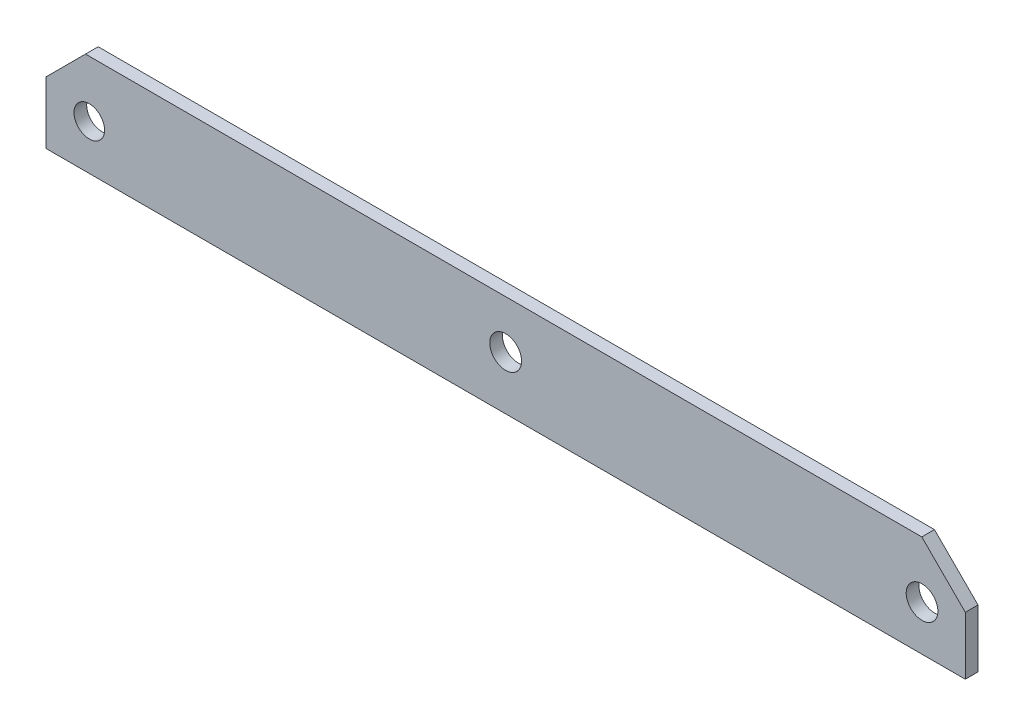
ISO-10303-21;
HEADER;
FILE_DESCRIPTION(('STEP AP214'),'2;1');
FILE_NAME('part.step','',(''),(''),'','','');
FILE_SCHEMA(('AUTOMOTIVE_DESIGN { 1 0 10303 214 1 1 1 1 }'));
ENDSEC;
DATA;
#1=APPLICATION_CONTEXT('core data for automotive mechanical design processes');
#2=APPLICATION_PROTOCOL_DEFINITION('international standard','automotive_design',2000,#1);
#3=PRODUCT_CONTEXT('',#1,'mechanical');
#4=PRODUCT('Part','Part','',(#3));
#5=PRODUCT_RELATED_PRODUCT_CATEGORY('part','',(#4));
#6=PRODUCT_DEFINITION_FORMATION('','',#4);
#7=PRODUCT_DEFINITION_CONTEXT('part definition',#1,'design');
#8=PRODUCT_DEFINITION('design','',#6,#7);
#9=PRODUCT_DEFINITION_SHAPE('','',#8);
#10=(LENGTH_UNIT() NAMED_UNIT(*) SI_UNIT(.MILLI.,.METRE.));
#11=(NAMED_UNIT(*) PLANE_ANGLE_UNIT() SI_UNIT($,.RADIAN.));
#12=(NAMED_UNIT(*) SI_UNIT($,.STERADIAN.) SOLID_ANGLE_UNIT());
#13=UNCERTAINTY_MEASURE_WITH_UNIT(LENGTH_MEASURE(1.E-05),#10,'distance_accuracy_value','');
#14=(GEOMETRIC_REPRESENTATION_CONTEXT(3) GLOBAL_UNCERTAINTY_ASSIGNED_CONTEXT((#13)) GLOBAL_UNIT_ASSIGNED_CONTEXT((#10,
#11,#12)) REPRESENTATION_CONTEXT('',''));
#15=CARTESIAN_POINT('',(0.,0.,0.));
#16=DIRECTION('',(0.,0.,1.));
#17=DIRECTION('',(1.,0.,0.));
#18=AXIS2_PLACEMENT_3D('',#15,#16,#17);
#19=CARTESIAN_POINT('',(122.254977285979,122.254977285981,3.175));
#20=DIRECTION('',(0.707106781186539,0.707106781186556,0.));
#21=DIRECTION('',(-0.707106781186556,0.707106781186539,0.));
#22=AXIS2_PLACEMENT_3D('',#19,#20,#21);
#23=PLANE('',#22);
#24=DIRECTION('',(0.707106781186556,-0.707106781186539,0.));
#25=VECTOR('',#24,1.);
#26=CARTESIAN_POINT('',(122.254977285979,122.254977285981,0.));
#27=LINE('',#26,#25);
#28=CARTESIAN_POINT('',(219.109954571962,25.4,0.));
#29=VERTEX_POINT('',#28);
#30=CARTESIAN_POINT('',(230.,14.5099545719626,0.));
#31=VERTEX_POINT('',#30);
#32=EDGE_CURVE('E128',#29,#31,#27,.T.);
#33=ORIENTED_EDGE('',*,*,#32,.F.);
#34=DIRECTION('',(0.,0.,-1.));
#35=VECTOR('',#34,1.);
#36=CARTESIAN_POINT('',(219.109954571962,25.4,3.175));
#37=LINE('',#36,#35);
#38=CARTESIAN_POINT('',(219.109954571962,25.4,3.175));
#39=VERTEX_POINT('',#38);
#40=EDGE_CURVE('E11',#39,#29,#37,.T.);
#41=ORIENTED_EDGE('',*,*,#40,.F.);
#42=DIRECTION('',(0.707106781186556,-0.707106781186539,0.));
#43=VECTOR('',#42,1.);
#44=CARTESIAN_POINT('',(122.254977285979,122.254977285981,3.175));
#45=LINE('',#44,#43);
#46=CARTESIAN_POINT('',(230.,14.5099545719626,3.175));
#47=VERTEX_POINT('',#46);
#48=EDGE_CURVE('E192',#39,#47,#45,.T.);
#49=ORIENTED_EDGE('',*,*,#48,.T.);
#50=DIRECTION('',(0.,0.,-1.));
#51=VECTOR('',#50,1.);
#52=CARTESIAN_POINT('',(230.,14.5099545719626,3.175));
#53=LINE('',#52,#51);
#54=EDGE_CURVE('E79',#47,#31,#53,.T.);
#55=ORIENTED_EDGE('',*,*,#54,.T.);
#56=EDGE_LOOP('',(#33,#41,#49,#55));
#57=FACE_BOUND('',#56,.T.);
#58=ADVANCED_FACE('F33',(#57),#23,.T.);
#59=CARTESIAN_POINT('',(0.,25.4,3.175));
#60=DIRECTION('',(0.,1.,0.));
#61=DIRECTION('',(0.,0.,1.));
#62=AXIS2_PLACEMENT_3D('',#59,#60,#61);
#63=PLANE('',#62);
#64=DIRECTION('',(1.,0.,0.));
#65=VECTOR('',#64,1.);
#66=CARTESIAN_POINT('',(0.,25.4,0.));
#67=LINE('',#66,#65);
#68=CARTESIAN_POINT('',(9.87852439365131,25.4,0.));
#69=VERTEX_POINT('',#68);
#70=EDGE_CURVE('E130',#69,#29,#67,.T.);
#71=ORIENTED_EDGE('',*,*,#70,.F.);
#72=DIRECTION('',(0.,0.,-1.));
#73=VECTOR('',#72,1.);
#74=CARTESIAN_POINT('',(9.87852439365131,25.4,3.175));
#75=LINE('',#74,#73);
#76=CARTESIAN_POINT('',(9.87852439365131,25.4,3.175));
#77=VERTEX_POINT('',#76);
#78=EDGE_CURVE('E42',#77,#69,#75,.T.);
#79=ORIENTED_EDGE('',*,*,#78,.F.);
#80=DIRECTION('',(1.,0.,0.));
#81=VECTOR('',#80,1.);
#82=CARTESIAN_POINT('',(0.,25.4,3.175));
#83=LINE('',#82,#81);
#84=EDGE_CURVE('E114',#77,#39,#83,.T.);
#85=ORIENTED_EDGE('',*,*,#84,.T.);
#86=ORIENTED_EDGE('',*,*,#40,.T.);
#87=EDGE_LOOP('',(#71,#79,#85,#86));
#88=FACE_BOUND('',#87,.T.);
#89=ADVANCED_FACE('F149',(#88),#63,.T.);
#90=CARTESIAN_POINT('',(-7.76073780317433,7.7607378031743,3.175));
#91=DIRECTION('',(-0.707106781186549,0.707106781186546,0.));
#92=DIRECTION('',(-0.707106781186546,-0.707106781186549,0.));
#93=AXIS2_PLACEMENT_3D('',#90,#91,#92);
#94=PLANE('',#93);
#95=DIRECTION('',(0.707106781186546,0.707106781186549,0.));
#96=VECTOR('',#95,1.);
#97=CARTESIAN_POINT('',(-7.76073780317433,7.7607378031743,0.));
#98=LINE('',#97,#96);
#99=CARTESIAN_POINT('',(0.,15.5214756063486,0.));
#100=VERTEX_POINT('',#99);
#101=EDGE_CURVE('E133',#100,#69,#98,.T.);
#102=ORIENTED_EDGE('',*,*,#101,.F.);
#103=DIRECTION('',(0.,0.,-1.));
#104=VECTOR('',#103,1.);
#105=CARTESIAN_POINT('',(0.,15.5214756063486,3.175));
#106=LINE('',#105,#104);
#107=CARTESIAN_POINT('',(0.,15.5214756063486,3.175));
#108=VERTEX_POINT('',#107);
#109=EDGE_CURVE('E101',#108,#100,#106,.T.);
#110=ORIENTED_EDGE('',*,*,#109,.F.);
#111=DIRECTION('',(0.707106781186546,0.707106781186549,0.));
#112=VECTOR('',#111,1.);
#113=CARTESIAN_POINT('',(-7.76073780317433,7.7607378031743,3.175));
#114=LINE('',#113,#112);
#115=EDGE_CURVE('E112',#108,#77,#114,.T.);
#116=ORIENTED_EDGE('',*,*,#115,.T.);
#117=ORIENTED_EDGE('',*,*,#78,.T.);
#118=EDGE_LOOP('',(#102,#110,#116,#117));
#119=FACE_BOUND('',#118,.T.);
#120=ADVANCED_FACE('F146',(#119),#94,.T.);
#121=CARTESIAN_POINT('',(0.,0.,3.175));
#122=DIRECTION('',(-1.,0.,0.));
#123=DIRECTION('',(0.,-1.,0.));
#124=AXIS2_PLACEMENT_3D('',#121,#122,#123);
#125=PLANE('',#124);
#126=DIRECTION('',(0.,1.,0.));
#127=VECTOR('',#126,1.);
#128=CARTESIAN_POINT('',(0.,0.,0.));
#129=LINE('',#128,#127);
#130=CARTESIAN_POINT('',(0.,0.,0.));
#131=VERTEX_POINT('',#130);
#132=EDGE_CURVE('E98',#131,#100,#129,.T.);
#133=ORIENTED_EDGE('',*,*,#132,.F.);
#134=DIRECTION('',(0.,0.,-1.));
#135=VECTOR('',#134,1.);
#136=CARTESIAN_POINT('',(0.,0.,3.175));
#137=LINE('',#136,#135);
#138=CARTESIAN_POINT('',(0.,0.,3.175));
#139=VERTEX_POINT('',#138);
#140=EDGE_CURVE('E92',#139,#131,#137,.T.);
#141=ORIENTED_EDGE('',*,*,#140,.F.);
#142=DIRECTION('',(0.,1.,0.));
#143=VECTOR('',#142,1.);
#144=CARTESIAN_POINT('',(0.,0.,3.175));
#145=LINE('',#144,#143);
#146=EDGE_CURVE('E96',#139,#108,#145,.T.);
#147=ORIENTED_EDGE('',*,*,#146,.T.);
#148=ORIENTED_EDGE('',*,*,#109,.T.);
#149=EDGE_LOOP('',(#133,#141,#147,#148));
#150=FACE_BOUND('',#149,.T.);
#151=ADVANCED_FACE('F94',(#150),#125,.T.);
#152=CARTESIAN_POINT('',(0.,0.,3.175));
#153=DIRECTION('',(0.,1.,0.));
#154=DIRECTION('',(0.,0.,1.));
#155=AXIS2_PLACEMENT_3D('',#152,#153,#154);
#156=PLANE('',#155);
#157=DIRECTION('',(1.,0.,0.));
#158=VECTOR('',#157,1.);
#159=CARTESIAN_POINT('',(0.,0.,0.));
#160=LINE('',#159,#158);
#161=CARTESIAN_POINT('',(230.,0.,0.));
#162=VERTEX_POINT('',#161);
#163=EDGE_CURVE('E137',#131,#162,#160,.T.);
#164=ORIENTED_EDGE('',*,*,#163,.T.);
#165=DIRECTION('',(0.,0.,-1.));
#166=VECTOR('',#165,1.);
#167=CARTESIAN_POINT('',(230.,0.,3.175));
#168=LINE('',#167,#166);
#169=CARTESIAN_POINT('',(230.,0.,3.175));
#170=VERTEX_POINT('',#169);
#171=EDGE_CURVE('E102',#170,#162,#168,.T.);
#172=ORIENTED_EDGE('',*,*,#171,.F.);
#173=DIRECTION('',(1.,0.,0.));
#174=VECTOR('',#173,1.);
#175=CARTESIAN_POINT('',(0.,0.,3.175));
#176=LINE('',#175,#174);
#177=EDGE_CURVE('E105',#139,#170,#176,.T.);
#178=ORIENTED_EDGE('',*,*,#177,.F.);
#179=ORIENTED_EDGE('',*,*,#140,.T.);
#180=EDGE_LOOP('',(#164,#172,#178,#179));
#181=FACE_BOUND('',#180,.T.);
#182=ADVANCED_FACE('F106',(#181),#156,.F.);
#183=CARTESIAN_POINT('',(10.827296289935,11.2956102799355,3.175));
#184=DIRECTION('',(0.,0.,-1.));
#185=DIRECTION('',(-1.,0.,0.));
#186=AXIS2_PLACEMENT_3D('',#183,#184,#185);
#187=CYLINDRICAL_SURFACE('',#186,3.82498757359968);
#188=CARTESIAN_POINT('',(10.827296289935,11.2956102799355,3.175));
#189=DIRECTION('',(0.,0.,1.));
#190=DIRECTION('',(1.,0.,0.));
#191=AXIS2_PLACEMENT_3D('',#188,#189,#190);
#192=CIRCLE('',#191,3.82498757359968);
#193=CARTESIAN_POINT('',(14.6522838635347,11.2956102799355,3.175));
#194=VERTEX_POINT('',#193);
#195=EDGE_CURVE('E189',#194,#194,#192,.T.);
#196=ORIENTED_EDGE('',*,*,#195,.T.);
#197=EDGE_LOOP('',(#196));
#198=FACE_BOUND('',#197,.T.);
#199=CARTESIAN_POINT('',(10.827296289935,11.2956102799355,0.));
#200=DIRECTION('',(0.,0.,1.));
#201=DIRECTION('',(1.,0.,0.));
#202=AXIS2_PLACEMENT_3D('',#199,#200,#201);
#203=CIRCLE('',#202,3.82498757359968);
#204=CARTESIAN_POINT('',(14.6522838635347,11.2956102799355,0.));
#205=VERTEX_POINT('',#204);
#206=EDGE_CURVE('E125',#205,#205,#203,.T.);
#207=ORIENTED_EDGE('',*,*,#206,.F.);
#208=EDGE_LOOP('',(#207));
#209=FACE_BOUND('',#208,.T.);
#210=ADVANCED_FACE('F170',(#198,#209),#187,.F.);
#211=CARTESIAN_POINT('',(115.,13.4,3.175));
#212=DIRECTION('',(0.,0.,-1.));
#213=DIRECTION('',(-1.,0.,0.));
#214=AXIS2_PLACEMENT_3D('',#211,#212,#213);
#215=CYLINDRICAL_SURFACE('',#214,3.97949019683394);
#216=CARTESIAN_POINT('',(115.,13.4,3.175));
#217=DIRECTION('',(0.,0.,1.));
#218=DIRECTION('',(1.,0.,0.));
#219=AXIS2_PLACEMENT_3D('',#216,#217,#218);
#220=CIRCLE('',#219,3.97949019683394);
#221=CARTESIAN_POINT('',(118.979490196834,13.4,3.175));
#222=VERTEX_POINT('',#221);
#223=EDGE_CURVE('E183',#222,#222,#220,.T.);
#224=ORIENTED_EDGE('',*,*,#223,.T.);
#225=EDGE_LOOP('',(#224));
#226=FACE_BOUND('',#225,.T.);
#227=CARTESIAN_POINT('',(115.,13.4,0.));
#228=DIRECTION('',(0.,0.,1.));
#229=DIRECTION('',(1.,0.,0.));
#230=AXIS2_PLACEMENT_3D('',#227,#228,#229);
#231=CIRCLE('',#230,3.97949019683394);
#232=CARTESIAN_POINT('',(118.979490196834,13.4,0.));
#233=VERTEX_POINT('',#232);
#234=EDGE_CURVE('E122',#233,#233,#231,.T.);
#235=ORIENTED_EDGE('',*,*,#234,.F.);
#236=EDGE_LOOP('',(#235));
#237=FACE_BOUND('',#236,.T.);
#238=ADVANCED_FACE('F172',(#226,#237),#215,.F.);
#239=CARTESIAN_POINT('',(219.172703710059,11.2956102799345,3.175));
#240=DIRECTION('',(0.,0.,-1.));
#241=DIRECTION('',(-1.,0.,0.));
#242=AXIS2_PLACEMENT_3D('',#239,#240,#241);
#243=CYLINDRICAL_SURFACE('',#242,3.96006972292955);
#244=CARTESIAN_POINT('',(219.172703710059,11.2956102799345,3.175));
#245=DIRECTION('',(0.,0.,1.));
#246=DIRECTION('',(1.,0.,0.));
#247=AXIS2_PLACEMENT_3D('',#244,#245,#246);
#248=CIRCLE('',#247,3.96006972292955);
#249=CARTESIAN_POINT('',(223.132773432989,11.2956102799345,3.175));
#250=VERTEX_POINT('',#249);
#251=EDGE_CURVE('E140',#250,#250,#248,.T.);
#252=ORIENTED_EDGE('',*,*,#251,.T.);
#253=EDGE_LOOP('',(#252));
#254=FACE_BOUND('',#253,.T.);
#255=CARTESIAN_POINT('',(219.172703710059,11.2956102799345,0.));
#256=DIRECTION('',(0.,0.,1.));
#257=DIRECTION('',(1.,0.,0.));
#258=AXIS2_PLACEMENT_3D('',#255,#256,#257);
#259=CIRCLE('',#258,3.96006972292955);
#260=CARTESIAN_POINT('',(223.132773432989,11.2956102799345,0.));
#261=VERTEX_POINT('',#260);
#262=EDGE_CURVE('E119',#261,#261,#259,.T.);
#263=ORIENTED_EDGE('',*,*,#262,.F.);
#264=EDGE_LOOP('',(#263));
#265=FACE_BOUND('',#264,.T.);
#266=ADVANCED_FACE('F35',(#254,#265),#243,.F.);
#267=CARTESIAN_POINT('',(230.,0.,3.175));
#268=DIRECTION('',(-1.,0.,0.));
#269=DIRECTION('',(0.,0.,1.));
#270=AXIS2_PLACEMENT_3D('',#267,#268,#269);
#271=PLANE('',#270);
#272=DIRECTION('',(0.,1.,0.));
#273=VECTOR('',#272,1.);
#274=CARTESIAN_POINT('',(230.,0.,0.));
#275=LINE('',#274,#273);
#276=EDGE_CURVE('E72',#162,#31,#275,.T.);
#277=ORIENTED_EDGE('',*,*,#276,.T.);
#278=ORIENTED_EDGE('',*,*,#54,.F.);
#279=DIRECTION('',(0.,1.,0.));
#280=VECTOR('',#279,1.);
#281=CARTESIAN_POINT('',(230.,0.,3.175));
#282=LINE('',#281,#280);
#283=EDGE_CURVE('E50',#170,#47,#282,.T.);
#284=ORIENTED_EDGE('',*,*,#283,.F.);
#285=ORIENTED_EDGE('',*,*,#171,.T.);
#286=EDGE_LOOP('',(#277,#278,#284,#285));
#287=FACE_BOUND('',#286,.T.);
#288=ADVANCED_FACE('F157',(#287),#271,.F.);
#289=CARTESIAN_POINT('',(0.,0.,3.175));
#290=DIRECTION('',(0.,0.,1.));
#291=DIRECTION('',(1.,0.,0.));
#292=AXIS2_PLACEMENT_3D('',#289,#290,#291);
#293=PLANE('',#292);
#294=ORIENTED_EDGE('',*,*,#251,.F.);
#295=EDGE_LOOP('',(#294));
#296=FACE_BOUND('',#295,.T.);
#297=ORIENTED_EDGE('',*,*,#223,.F.);
#298=EDGE_LOOP('',(#297));
#299=FACE_BOUND('',#298,.T.);
#300=ORIENTED_EDGE('',*,*,#195,.F.);
#301=EDGE_LOOP('',(#300));
#302=FACE_BOUND('',#301,.T.);
#303=ORIENTED_EDGE('',*,*,#48,.F.);
#304=ORIENTED_EDGE('',*,*,#84,.F.);
#305=ORIENTED_EDGE('',*,*,#115,.F.);
#306=ORIENTED_EDGE('',*,*,#146,.F.);
#307=ORIENTED_EDGE('',*,*,#177,.T.);
#308=ORIENTED_EDGE('',*,*,#283,.T.);
#309=EDGE_LOOP('',(#303,#304,#305,#306,#307,#308));
#310=FACE_BOUND('',#309,.T.);
#311=ADVANCED_FACE('F109',(#296,#299,#302,#310),#293,.T.);
#312=CARTESIAN_POINT('',(0.,0.,0.));
#313=DIRECTION('',(0.,0.,1.));
#314=DIRECTION('',(1.,0.,0.));
#315=AXIS2_PLACEMENT_3D('',#312,#313,#314);
#316=PLANE('',#315);
#317=ORIENTED_EDGE('',*,*,#262,.T.);
#318=EDGE_LOOP('',(#317));
#319=FACE_BOUND('',#318,.T.);
#320=ORIENTED_EDGE('',*,*,#234,.T.);
#321=EDGE_LOOP('',(#320));
#322=FACE_BOUND('',#321,.T.);
#323=ORIENTED_EDGE('',*,*,#206,.T.);
#324=EDGE_LOOP('',(#323));
#325=FACE_BOUND('',#324,.T.);
#326=ORIENTED_EDGE('',*,*,#32,.T.);
#327=ORIENTED_EDGE('',*,*,#276,.F.);
#328=ORIENTED_EDGE('',*,*,#163,.F.);
#329=ORIENTED_EDGE('',*,*,#132,.T.);
#330=ORIENTED_EDGE('',*,*,#101,.T.);
#331=ORIENTED_EDGE('',*,*,#70,.T.);
#332=EDGE_LOOP('',(#326,#327,#328,#329,#330,#331));
#333=FACE_BOUND('',#332,.T.);
#334=ADVANCED_FACE('F150',(#319,#322,#325,#333),#316,.F.);
#335=CLOSED_SHELL('',(#58,#89,#120,#151,#182,#210,#238,#266,#288,#311,#334));
#336=MANIFOLD_SOLID_BREP('B2',#335);
#337=ADVANCED_BREP_SHAPE_REPRESENTATION('',(#18,#336),#14);
#338=SHAPE_DEFINITION_REPRESENTATION(#9,#337);
ENDSEC;
END-ISO-10303-21;
